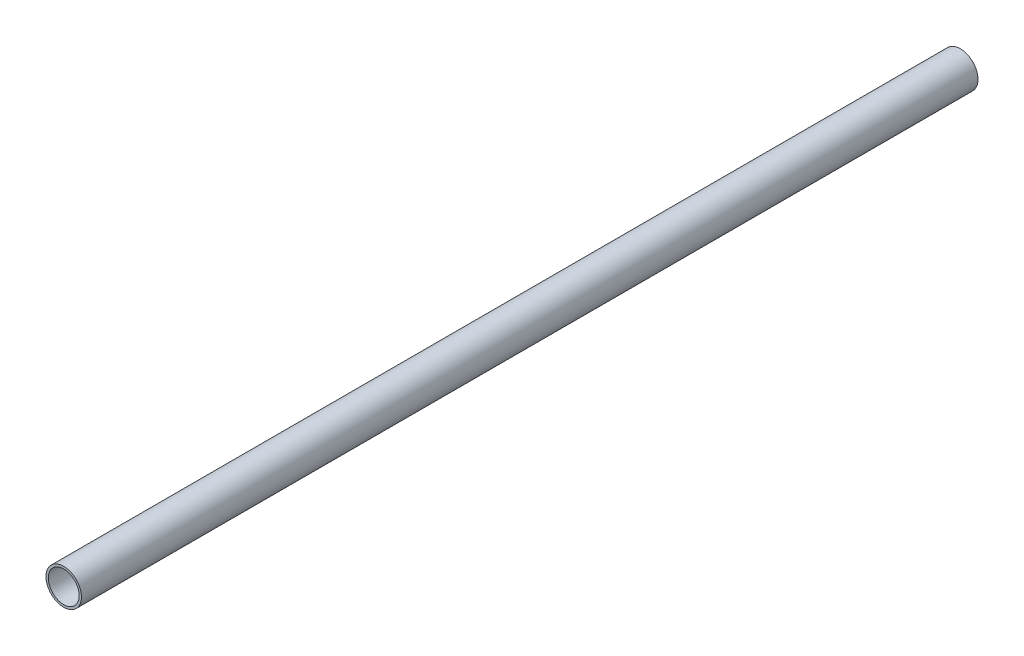
ISO-10303-21;
HEADER;
FILE_DESCRIPTION(('STEP AP214'),'2;1');
FILE_NAME('part.step','',(''),(''),'','','');
FILE_SCHEMA(('AUTOMOTIVE_DESIGN { 1 0 10303 214 1 1 1 1 }'));
ENDSEC;
DATA;
#1=APPLICATION_CONTEXT('core data for automotive mechanical design processes');
#2=APPLICATION_PROTOCOL_DEFINITION('international standard','automotive_design',2000,#1);
#3=PRODUCT_CONTEXT('',#1,'mechanical');
#4=PRODUCT('Part','Part','',(#3));
#5=PRODUCT_RELATED_PRODUCT_CATEGORY('part','',(#4));
#6=PRODUCT_DEFINITION_FORMATION('','',#4);
#7=PRODUCT_DEFINITION_CONTEXT('part definition',#1,'design');
#8=PRODUCT_DEFINITION('design','',#6,#7);
#9=PRODUCT_DEFINITION_SHAPE('','',#8);
#10=(LENGTH_UNIT() NAMED_UNIT(*) SI_UNIT(.MILLI.,.METRE.));
#11=(NAMED_UNIT(*) PLANE_ANGLE_UNIT() SI_UNIT($,.RADIAN.));
#12=(NAMED_UNIT(*) SI_UNIT($,.STERADIAN.) SOLID_ANGLE_UNIT());
#13=UNCERTAINTY_MEASURE_WITH_UNIT(LENGTH_MEASURE(1.E-05),#10,'distance_accuracy_value','');
#14=(GEOMETRIC_REPRESENTATION_CONTEXT(3) GLOBAL_UNCERTAINTY_ASSIGNED_CONTEXT((#13)) GLOBAL_UNIT_ASSIGNED_CONTEXT((#10,
#11,#12)) REPRESENTATION_CONTEXT('',''));
#15=CARTESIAN_POINT('',(0.,0.,0.));
#16=DIRECTION('',(0.,0.,1.));
#17=DIRECTION('',(1.,0.,0.));
#18=AXIS2_PLACEMENT_3D('',#15,#16,#17);
#19=CARTESIAN_POINT('',(0.,0.,1524.));
#20=DIRECTION('',(0.,0.,1.));
#21=DIRECTION('',(1.,0.,0.));
#22=AXIS2_PLACEMENT_3D('',#19,#20,#21);
#23=PLANE('',#22);
#24=CARTESIAN_POINT('',(0.,0.,1524.));
#25=DIRECTION('',(0.,0.,1.));
#26=DIRECTION('',(1.,0.,0.));
#27=AXIS2_PLACEMENT_3D('',#24,#25,#26);
#28=CIRCLE('',#27,30.1625);
#29=CARTESIAN_POINT('',(30.1625,0.,1524.));
#30=VERTEX_POINT('',#29);
#31=EDGE_CURVE('E10',#30,#30,#28,.T.);
#32=ORIENTED_EDGE('',*,*,#31,.T.);
#33=EDGE_LOOP('',(#32));
#34=FACE_BOUND('',#33,.T.);
#35=CARTESIAN_POINT('',(0.,0.,1524.));
#36=DIRECTION('',(0.,0.,1.));
#37=DIRECTION('',(1.,0.,0.));
#38=AXIS2_PLACEMENT_3D('',#35,#36,#37);
#39=CIRCLE('',#38,26.2509);
#40=CARTESIAN_POINT('',(26.2509,0.,1524.));
#41=VERTEX_POINT('',#40);
#42=EDGE_CURVE('E54',#41,#41,#39,.T.);
#43=ORIENTED_EDGE('',*,*,#42,.F.);
#44=EDGE_LOOP('',(#43));
#45=FACE_BOUND('',#44,.T.);
#46=ADVANCED_FACE('F41',(#34,#45),#23,.T.);
#47=CARTESIAN_POINT('',(0.,0.,0.));
#48=DIRECTION('',(0.,0.,1.));
#49=DIRECTION('',(1.,0.,0.));
#50=AXIS2_PLACEMENT_3D('',#47,#48,#49);
#51=PLANE('',#50);
#52=CARTESIAN_POINT('',(0.,0.,0.));
#53=DIRECTION('',(0.,0.,1.));
#54=DIRECTION('',(1.,0.,0.));
#55=AXIS2_PLACEMENT_3D('',#52,#53,#54);
#56=CIRCLE('',#55,30.1625);
#57=CARTESIAN_POINT('',(30.1625,0.,0.));
#58=VERTEX_POINT('',#57);
#59=EDGE_CURVE('E45',#58,#58,#56,.T.);
#60=ORIENTED_EDGE('',*,*,#59,.F.);
#61=EDGE_LOOP('',(#60));
#62=FACE_BOUND('',#61,.T.);
#63=CARTESIAN_POINT('',(0.,0.,0.));
#64=DIRECTION('',(0.,0.,1.));
#65=DIRECTION('',(1.,0.,0.));
#66=AXIS2_PLACEMENT_3D('',#63,#64,#65);
#67=CIRCLE('',#66,26.2509);
#68=CARTESIAN_POINT('',(26.2509,0.,0.));
#69=VERTEX_POINT('',#68);
#70=EDGE_CURVE('E56',#69,#69,#67,.T.);
#71=ORIENTED_EDGE('',*,*,#70,.T.);
#72=EDGE_LOOP('',(#71));
#73=FACE_BOUND('',#72,.T.);
#74=ADVANCED_FACE('F68',(#62,#73),#51,.F.);
#75=CARTESIAN_POINT('',(0.,0.,1524.));
#76=DIRECTION('',(0.,0.,-1.));
#77=DIRECTION('',(-1.,0.,0.));
#78=AXIS2_PLACEMENT_3D('',#75,#76,#77);
#79=CYLINDRICAL_SURFACE('',#78,30.1625);
#80=ORIENTED_EDGE('',*,*,#31,.F.);
#81=EDGE_LOOP('',(#80));
#82=FACE_BOUND('',#81,.T.);
#83=ORIENTED_EDGE('',*,*,#59,.T.);
#84=EDGE_LOOP('',(#83));
#85=FACE_BOUND('',#84,.T.);
#86=ADVANCED_FACE('F43',(#82,#85),#79,.T.);
#87=CARTESIAN_POINT('',(0.,0.,1524.));
#88=DIRECTION('',(0.,0.,-1.));
#89=DIRECTION('',(-1.,0.,0.));
#90=AXIS2_PLACEMENT_3D('',#87,#88,#89);
#91=CYLINDRICAL_SURFACE('',#90,26.2509);
#92=ORIENTED_EDGE('',*,*,#42,.T.);
#93=EDGE_LOOP('',(#92));
#94=FACE_BOUND('',#93,.T.);
#95=ORIENTED_EDGE('',*,*,#70,.F.);
#96=EDGE_LOOP('',(#95));
#97=FACE_BOUND('',#96,.T.);
#98=ADVANCED_FACE('F64',(#94,#97),#91,.F.);
#99=CLOSED_SHELL('',(#46,#74,#86,#98));
#100=MANIFOLD_SOLID_BREP('B2',#99);
#101=ADVANCED_BREP_SHAPE_REPRESENTATION('',(#18,#100),#14);
#102=SHAPE_DEFINITION_REPRESENTATION(#9,#101);
ENDSEC;
END-ISO-10303-21;
